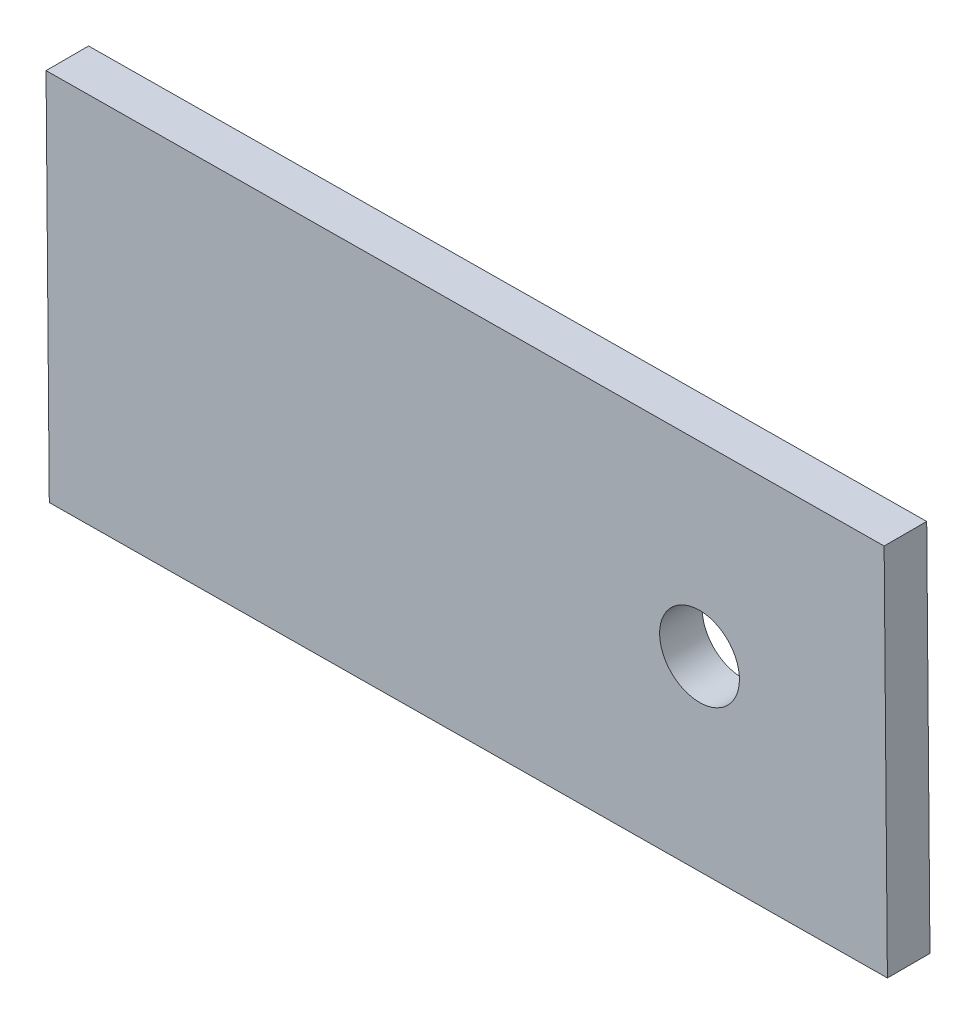
ISO-10303-21;
HEADER;
FILE_DESCRIPTION(('STEP AP214'),'2;1');
FILE_NAME('part.step','',(''),(''),'','','');
FILE_SCHEMA(('AUTOMOTIVE_DESIGN { 1 0 10303 214 1 1 1 1 }'));
ENDSEC;
DATA;
#1=APPLICATION_CONTEXT('core data for automotive mechanical design processes');
#2=APPLICATION_PROTOCOL_DEFINITION('international standard','automotive_design',2000,#1);
#3=PRODUCT_CONTEXT('',#1,'mechanical');
#4=PRODUCT('Part','Part','',(#3));
#5=PRODUCT_RELATED_PRODUCT_CATEGORY('part','',(#4));
#6=PRODUCT_DEFINITION_FORMATION('','',#4);
#7=PRODUCT_DEFINITION_CONTEXT('part definition',#1,'design');
#8=PRODUCT_DEFINITION('design','',#6,#7);
#9=PRODUCT_DEFINITION_SHAPE('','',#8);
#10=(LENGTH_UNIT() NAMED_UNIT(*) SI_UNIT(.MILLI.,.METRE.));
#11=(NAMED_UNIT(*) PLANE_ANGLE_UNIT() SI_UNIT($,.RADIAN.));
#12=(NAMED_UNIT(*) SI_UNIT($,.STERADIAN.) SOLID_ANGLE_UNIT());
#13=UNCERTAINTY_MEASURE_WITH_UNIT(LENGTH_MEASURE(1.E-05),#10,'distance_accuracy_value','');
#14=(GEOMETRIC_REPRESENTATION_CONTEXT(3) GLOBAL_UNCERTAINTY_ASSIGNED_CONTEXT((#13)) GLOBAL_UNIT_ASSIGNED_CONTEXT((#10,
#11,#12)) REPRESENTATION_CONTEXT('',''));
#15=CARTESIAN_POINT('',(0.,0.,0.));
#16=DIRECTION('',(0.,0.,1.));
#17=DIRECTION('',(1.,0.,0.));
#18=AXIS2_PLACEMENT_3D('',#15,#16,#17);
#19=CARTESIAN_POINT('',(-0.0613460472547595,14.0593891657099,3.67002499999994));
#20=DIRECTION('',(0.,0.,-1.));
#21=DIRECTION('',(0.,1.,0.));
#22=AXIS2_PLACEMENT_3D('',#19,#20,#21);
#23=PLANE('',#22);
#24=DIRECTION('',(-0.00872653549837334,0.999961923064171,0.));
#25=VECTOR('',#24,1.);
#26=CARTESIAN_POINT('',(31.4985402777552,7.33454157245946,3.67002499999989));
#27=LINE('',#26,#25);
#28=CARTESIAN_POINT('',(31.5596260262439,0.33480811101026,3.67002499999989));
#29=VERTEX_POINT('',#28);
#30=CARTESIAN_POINT('',(31.4374545292666,14.3342750339087,3.67002499999992));
#31=VERTEX_POINT('',#30);
#32=EDGE_CURVE('E67',#29,#31,#27,.T.);
#33=ORIENTED_EDGE('',*,*,#32,.F.);
#34=DIRECTION('',(0.999961923064171,0.00872653549837334,0.));
#35=VECTOR('',#34,1.);
#36=CARTESIAN_POINT('',(15.8102257379832,0.197365176910883,3.67002499999989));
#37=LINE('',#36,#35);
#38=CARTESIAN_POINT('',(0.0608254497224695,0.0599222428115023,3.6700249999999));
#39=VERTEX_POINT('',#38);
#40=EDGE_CURVE('E58',#39,#29,#37,.T.);
#41=ORIENTED_EDGE('',*,*,#40,.F.);
#42=DIRECTION('',(0.00872653549837334,-0.999961923064171,0.));
#43=VECTOR('',#42,1.);
#44=CARTESIAN_POINT('',(-0.000260298766146047,7.0596557042607,3.67002499999994));
#45=LINE('',#44,#43);
#46=CARTESIAN_POINT('',(-0.0613460472547595,14.0593891657099,3.67002499999994));
#47=VERTEX_POINT('',#46);
#48=EDGE_CURVE('E53',#47,#39,#45,.T.);
#49=ORIENTED_EDGE('',*,*,#48,.F.);
#50=DIRECTION('',(-0.999961923064171,-0.00872653549837334,0.));
#51=VECTOR('',#50,1.);
#52=CARTESIAN_POINT('',(15.6880542410059,14.1968320998093,3.67002499999994));
#53=LINE('',#52,#51);
#54=EDGE_CURVE('E71',#31,#47,#53,.T.);
#55=ORIENTED_EDGE('',*,*,#54,.F.);
#56=EDGE_LOOP('',(#33,#41,#49,#55));
#57=FACE_BOUND('',#56,.T.);
#58=CARTESIAN_POINT('',(24.4988068163061,7.27345582397085,3.67002499999991));
#59=DIRECTION('',(0.,0.,-1.));
#60=DIRECTION('',(0.,1.,0.));
#61=AXIS2_PLACEMENT_3D('',#58,#59,#60);
#62=CIRCLE('',#61,1.5);
#63=CARTESIAN_POINT('',(24.4988068163061,8.77345582397085,3.67002499999992));
#64=VERTEX_POINT('',#63);
#65=EDGE_CURVE('E20',#64,#64,#62,.F.);
#66=ORIENTED_EDGE('',*,*,#65,.T.);
#67=EDGE_LOOP('',(#66));
#68=FACE_BOUND('',#67,.T.);
#69=ADVANCED_FACE('F17',(#57,#68),#23,.T.);
#70=CARTESIAN_POINT('',(31.4985402777552,7.33454157245946,3.67002499999991));
#71=DIRECTION('',(0.999961923064171,0.00872653549837334,0.));
#72=DIRECTION('',(-0.00872653549837334,0.999961923064171,0.));
#73=AXIS2_PLACEMENT_3D('',#70,#71,#72);
#74=PLANE('',#73);
#75=ORIENTED_EDGE('',*,*,#32,.T.);
#76=DIRECTION('',(0.,0.,1.));
#77=VECTOR('',#76,1.);
#78=CARTESIAN_POINT('',(31.4374545292666,14.3342750339087,3.67002499999994));
#79=LINE('',#78,#77);
#80=CARTESIAN_POINT('',(31.4374545292666,14.3342750339087,5.27002499999994));
#81=VERTEX_POINT('',#80);
#82=EDGE_CURVE('E83',#81,#31,#79,.F.);
#83=ORIENTED_EDGE('',*,*,#82,.F.);
#84=DIRECTION('',(0.00872653549837882,-0.999961923064171,0.));
#85=VECTOR('',#84,1.);
#86=CARTESIAN_POINT('',(31.4374545292666,14.3342750339087,5.27002499999994));
#87=LINE('',#86,#85);
#88=CARTESIAN_POINT('',(31.5596260262439,0.334808111010256,5.27002499999992));
#89=VERTEX_POINT('',#88);
#90=EDGE_CURVE('E78',#81,#89,#87,.T.);
#91=ORIENTED_EDGE('',*,*,#90,.T.);
#92=DIRECTION('',(0.,0.,1.));
#93=VECTOR('',#92,1.);
#94=CARTESIAN_POINT('',(31.5596260262439,0.334808111010263,3.67002499999989));
#95=LINE('',#94,#93);
#96=EDGE_CURVE('E63',#29,#89,#95,.T.);
#97=ORIENTED_EDGE('',*,*,#96,.F.);
#98=EDGE_LOOP('',(#75,#83,#91,#97));
#99=FACE_BOUND('',#98,.T.);
#100=ADVANCED_FACE('F77',(#99),#74,.T.);
#101=CARTESIAN_POINT('',(15.8102257379832,0.197365176910883,3.67002499999989));
#102=DIRECTION('',(0.00872653549837334,-0.999961923064171,0.));
#103=DIRECTION('',(0.999961923064171,0.00872653549837334,0.));
#104=AXIS2_PLACEMENT_3D('',#101,#102,#103);
#105=PLANE('',#104);
#106=ORIENTED_EDGE('',*,*,#40,.T.);
#107=ORIENTED_EDGE('',*,*,#96,.T.);
#108=DIRECTION('',(-0.999961923064171,-0.00872653549837333,0.));
#109=VECTOR('',#108,1.);
#110=CARTESIAN_POINT('',(31.5596260262439,0.334808111010257,5.27002499999989));
#111=LINE('',#110,#109);
#112=CARTESIAN_POINT('',(0.0608254497224687,0.0599222428114982,5.27002499999989));
#113=VERTEX_POINT('',#112);
#114=EDGE_CURVE('E88',#89,#113,#111,.T.);
#115=ORIENTED_EDGE('',*,*,#114,.T.);
#116=DIRECTION('',(0.,0.,1.));
#117=VECTOR('',#116,1.);
#118=CARTESIAN_POINT('',(0.0608254497224673,0.0599222428115023,3.67002499999991));
#119=LINE('',#118,#117);
#120=EDGE_CURVE('E65',#39,#113,#119,.T.);
#121=ORIENTED_EDGE('',*,*,#120,.F.);
#122=EDGE_LOOP('',(#106,#107,#115,#121));
#123=FACE_BOUND('',#122,.T.);
#124=ADVANCED_FACE('F60',(#123),#105,.T.);
#125=CARTESIAN_POINT('',(-0.000260298766146047,7.0596557042607,3.67002499999991));
#126=DIRECTION('',(-0.999961923064171,-0.00872653549837334,0.));
#127=DIRECTION('',(0.00872653549837334,-0.999961923064171,0.));
#128=AXIS2_PLACEMENT_3D('',#125,#126,#127);
#129=PLANE('',#128);
#130=ORIENTED_EDGE('',*,*,#48,.T.);
#131=ORIENTED_EDGE('',*,*,#120,.T.);
#132=DIRECTION('',(-0.00872653549837334,0.999961923064171,0.));
#133=VECTOR('',#132,1.);
#134=CARTESIAN_POINT('',(0.0608254497224674,0.0599222428114971,5.27002499999989));
#135=LINE('',#134,#133);
#136=CARTESIAN_POINT('',(-0.0613460472547594,14.0593891657099,5.27002499999992));
#137=VERTEX_POINT('',#136);
#138=EDGE_CURVE('E90',#113,#137,#135,.T.);
#139=ORIENTED_EDGE('',*,*,#138,.T.);
#140=DIRECTION('',(0.,0.,1.));
#141=VECTOR('',#140,1.);
#142=CARTESIAN_POINT('',(-0.0613460472547595,14.0593891657099,3.67002499999994));
#143=LINE('',#142,#141);
#144=EDGE_CURVE('E34',#47,#137,#143,.T.);
#145=ORIENTED_EDGE('',*,*,#144,.F.);
#146=EDGE_LOOP('',(#130,#131,#139,#145));
#147=FACE_BOUND('',#146,.T.);
#148=ADVANCED_FACE('F97',(#147),#129,.T.);
#149=CARTESIAN_POINT('',(15.6880542410059,14.1968320998093,3.67002499999994));
#150=DIRECTION('',(-0.00872653549837334,0.999961923064171,0.));
#151=DIRECTION('',(-0.999961923064171,-0.00872653549837334,0.));
#152=AXIS2_PLACEMENT_3D('',#149,#150,#151);
#153=PLANE('',#152);
#154=ORIENTED_EDGE('',*,*,#54,.T.);
#155=ORIENTED_EDGE('',*,*,#144,.T.);
#156=DIRECTION('',(0.999961923064171,0.00872653549837461,0.));
#157=VECTOR('',#156,1.);
#158=CARTESIAN_POINT('',(-0.0613460472547594,14.0593891657099,5.27002499999994));
#159=LINE('',#158,#157);
#160=EDGE_CURVE('E26',#137,#81,#159,.T.);
#161=ORIENTED_EDGE('',*,*,#160,.T.);
#162=ORIENTED_EDGE('',*,*,#82,.T.);
#163=EDGE_LOOP('',(#154,#155,#161,#162));
#164=FACE_BOUND('',#163,.T.);
#165=ADVANCED_FACE('F93',(#164),#153,.T.);
#166=CARTESIAN_POINT('',(24.4988068163061,7.27345582397085,3.67002499999991));
#167=DIRECTION('',(0.,0.,-1.));
#168=DIRECTION('',(0.,1.,0.));
#169=AXIS2_PLACEMENT_3D('',#166,#167,#168);
#170=CYLINDRICAL_SURFACE('',#169,1.5);
#171=CARTESIAN_POINT('',(24.4988068163061,7.27345582397084,5.27002499999991));
#172=DIRECTION('',(0.,0.,-1.));
#173=DIRECTION('',(0.,1.,0.));
#174=AXIS2_PLACEMENT_3D('',#171,#172,#173);
#175=CIRCLE('',#174,1.5);
#176=CARTESIAN_POINT('',(24.4988068163061,8.77345582397084,5.27002499999992));
#177=VERTEX_POINT('',#176);
#178=EDGE_CURVE('E11',#177,#177,#175,.F.);
#179=ORIENTED_EDGE('',*,*,#178,.T.);
#180=EDGE_LOOP('',(#179));
#181=FACE_BOUND('',#180,.T.);
#182=ORIENTED_EDGE('',*,*,#65,.F.);
#183=EDGE_LOOP('',(#182));
#184=FACE_BOUND('',#183,.T.);
#185=ADVANCED_FACE('F105',(#181,#184),#170,.F.);
#186=CARTESIAN_POINT('',(-0.0613460472547594,14.0593891657099,5.27002499999994));
#187=DIRECTION('',(0.,0.,-1.));
#188=DIRECTION('',(0.,1.,0.));
#189=AXIS2_PLACEMENT_3D('',#186,#187,#188);
#190=PLANE('',#189);
#191=ORIENTED_EDGE('',*,*,#178,.F.);
#192=EDGE_LOOP('',(#191));
#193=FACE_BOUND('',#192,.T.);
#194=ORIENTED_EDGE('',*,*,#138,.F.);
#195=ORIENTED_EDGE('',*,*,#114,.F.);
#196=ORIENTED_EDGE('',*,*,#90,.F.);
#197=ORIENTED_EDGE('',*,*,#160,.F.);
#198=EDGE_LOOP('',(#194,#195,#196,#197));
#199=FACE_BOUND('',#198,.T.);
#200=ADVANCED_FACE('F96',(#193,#199),#190,.F.);
#201=CLOSED_SHELL('',(#69,#100,#124,#148,#165,#185,#200));
#202=MANIFOLD_SOLID_BREP('B1',#201);
#203=ADVANCED_BREP_SHAPE_REPRESENTATION('',(#18,#202),#14);
#204=SHAPE_DEFINITION_REPRESENTATION(#9,#203);
ENDSEC;
END-ISO-10303-21;
